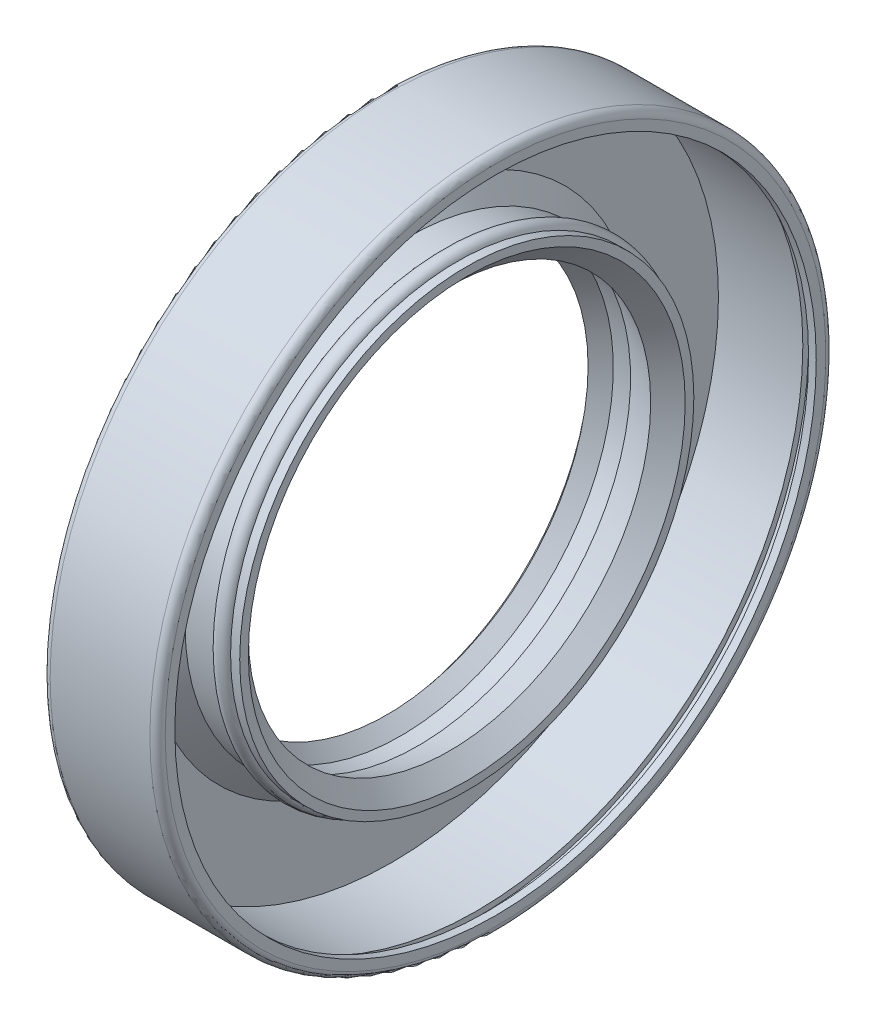
ISO-10303-21;
HEADER;
FILE_DESCRIPTION(('STEP AP214'),'2;1');
FILE_NAME('part.step','',(''),(''),'','','');
FILE_SCHEMA(('AUTOMOTIVE_DESIGN { 1 0 10303 214 1 1 1 1 }'));
ENDSEC;
DATA;
#1=APPLICATION_CONTEXT('core data for automotive mechanical design processes');
#2=APPLICATION_PROTOCOL_DEFINITION('international standard','automotive_design',2000,#1);
#3=PRODUCT_CONTEXT('',#1,'mechanical');
#4=PRODUCT('Part','Part','',(#3));
#5=PRODUCT_RELATED_PRODUCT_CATEGORY('part','',(#4));
#6=PRODUCT_DEFINITION_FORMATION('','',#4);
#7=PRODUCT_DEFINITION_CONTEXT('part definition',#1,'design');
#8=PRODUCT_DEFINITION('design','',#6,#7);
#9=PRODUCT_DEFINITION_SHAPE('','',#8);
#10=(LENGTH_UNIT() NAMED_UNIT(*) SI_UNIT(.MILLI.,.METRE.));
#11=(NAMED_UNIT(*) PLANE_ANGLE_UNIT() SI_UNIT($,.RADIAN.));
#12=(NAMED_UNIT(*) SI_UNIT($,.STERADIAN.) SOLID_ANGLE_UNIT());
#13=UNCERTAINTY_MEASURE_WITH_UNIT(LENGTH_MEASURE(1.E-05),#10,'distance_accuracy_value','');
#14=(GEOMETRIC_REPRESENTATION_CONTEXT(3) GLOBAL_UNCERTAINTY_ASSIGNED_CONTEXT((#13)) GLOBAL_UNIT_ASSIGNED_CONTEXT((#10,
#11,#12)) REPRESENTATION_CONTEXT('',''));
#15=CARTESIAN_POINT('',(0.,0.,0.));
#16=DIRECTION('',(0.,0.,1.));
#17=DIRECTION('',(1.,0.,0.));
#18=AXIS2_PLACEMENT_3D('',#15,#16,#17);
#19=CARTESIAN_POINT('',(0.,0.,-13.5725));
#20=DIRECTION('',(1.,0.,0.));
#21=DIRECTION('',(0.,0.,-1.));
#22=AXIS2_PLACEMENT_3D('',#19,#20,#21);
#23=PLANE('',#22);
#24=CARTESIAN_POINT('',(0.,0.,0.));
#25=DIRECTION('',(-1.,0.,0.));
#26=DIRECTION('',(0.,0.,1.));
#27=AXIS2_PLACEMENT_3D('',#24,#25,#26);
#28=CIRCLE('',#27,20.5233333333333);
#29=CARTESIAN_POINT('',(0.,0.,20.5233333333333));
#30=VERTEX_POINT('',#29);
#31=EDGE_CURVE('E70',#30,#30,#28,.T.);
#32=ORIENTED_EDGE('',*,*,#31,.T.);
#33=EDGE_LOOP('',(#32));
#34=FACE_BOUND('',#33,.T.);
#35=CARTESIAN_POINT('',(0.,0.,0.));
#36=DIRECTION('',(1.,0.,0.));
#37=DIRECTION('',(0.,0.,-1.));
#38=AXIS2_PLACEMENT_3D('',#35,#36,#37);
#39=CIRCLE('',#38,13.93);
#40=CARTESIAN_POINT('',(0.,0.,-13.93));
#41=VERTEX_POINT('',#40);
#42=EDGE_CURVE('E10',#41,#41,#39,.F.);
#43=ORIENTED_EDGE('',*,*,#42,.F.);
#44=EDGE_LOOP('',(#43));
#45=FACE_BOUND('',#44,.T.);
#46=ADVANCED_FACE('F32',(#34,#45),#23,.F.);
#47=CARTESIAN_POINT('',(0.,0.,0.));
#48=DIRECTION('',(-1.,0.,0.));
#49=DIRECTION('',(0.,0.,1.));
#50=AXIS2_PLACEMENT_3D('',#47,#48,#49);
#51=CYLINDRICAL_SURFACE('',#50,20.285);
#52=CARTESIAN_POINT('',(5.95833333333333,0.,0.));
#53=DIRECTION('',(-1.,0.,0.));
#54=DIRECTION('',(0.,0.,1.));
#55=AXIS2_PLACEMENT_3D('',#52,#53,#54);
#56=CIRCLE('',#55,20.285);
#57=CARTESIAN_POINT('',(5.95833333333333,0.,20.285));
#58=VERTEX_POINT('',#57);
#59=EDGE_CURVE('E40',#58,#58,#56,.T.);
#60=ORIENTED_EDGE('',*,*,#59,.F.);
#61=EDGE_LOOP('',(#60));
#62=FACE_BOUND('',#61,.T.);
#63=CARTESIAN_POINT('',(0.715,0.,0.));
#64=DIRECTION('',(-1.,0.,0.));
#65=DIRECTION('',(0.,0.,1.));
#66=AXIS2_PLACEMENT_3D('',#63,#64,#65);
#67=CIRCLE('',#66,20.285);
#68=CARTESIAN_POINT('',(0.715,0.,20.285));
#69=VERTEX_POINT('',#68);
#70=EDGE_CURVE('E112',#69,#69,#67,.T.);
#71=ORIENTED_EDGE('',*,*,#70,.T.);
#72=EDGE_LOOP('',(#71));
#73=FACE_BOUND('',#72,.T.);
#74=ADVANCED_FACE('F34',(#62,#73),#51,.F.);
#75=CARTESIAN_POINT('',(5.95833333333333,0.,-20.285));
#76=DIRECTION('',(-1.,0.,0.));
#77=DIRECTION('',(0.,0.,1.));
#78=AXIS2_PLACEMENT_3D('',#75,#76,#77);
#79=PLANE('',#78);
#80=CARTESIAN_POINT('',(5.95833333333333,0.,0.));
#81=DIRECTION('',(-1.,0.,0.));
#82=DIRECTION('',(0.,0.,1.));
#83=AXIS2_PLACEMENT_3D('',#80,#81,#82);
#84=CIRCLE('',#83,20.6425);
#85=CARTESIAN_POINT('',(5.95833333333333,0.,20.6425));
#86=VERTEX_POINT('',#85);
#87=EDGE_CURVE('E46',#86,#86,#84,.T.);
#88=ORIENTED_EDGE('',*,*,#87,.F.);
#89=EDGE_LOOP('',(#88));
#90=FACE_BOUND('',#89,.T.);
#91=ORIENTED_EDGE('',*,*,#59,.T.);
#92=EDGE_LOOP('',(#91));
#93=FACE_BOUND('',#92,.T.);
#94=ADVANCED_FACE('F210',(#90,#93),#79,.F.);
#95=CARTESIAN_POINT('',(0.,0.,0.));
#96=DIRECTION('',(-1.,0.,0.));
#97=DIRECTION('',(0.,0.,1.));
#98=AXIS2_PLACEMENT_3D('',#95,#96,#97);
#99=CYLINDRICAL_SURFACE('',#98,20.6425);
#100=CARTESIAN_POINT('',(6.67333333333333,0.,0.));
#101=DIRECTION('',(-1.,0.,0.));
#102=DIRECTION('',(0.,0.,1.));
#103=AXIS2_PLACEMENT_3D('',#100,#101,#102);
#104=CIRCLE('',#103,20.6425);
#105=CARTESIAN_POINT('',(6.67333333333333,0.,20.6425));
#106=VERTEX_POINT('',#105);
#107=EDGE_CURVE('E50',#106,#106,#104,.T.);
#108=ORIENTED_EDGE('',*,*,#107,.F.);
#109=EDGE_LOOP('',(#108));
#110=FACE_BOUND('',#109,.T.);
#111=ORIENTED_EDGE('',*,*,#87,.T.);
#112=EDGE_LOOP('',(#111));
#113=FACE_BOUND('',#112,.T.);
#114=ADVANCED_FACE('F243',(#110,#113),#99,.F.);
#115=CARTESIAN_POINT('',(6.67333333333333,0.,-20.6425));
#116=DIRECTION('',(1.,0.,0.));
#117=DIRECTION('',(0.,0.,-1.));
#118=AXIS2_PLACEMENT_3D('',#115,#116,#117);
#119=PLANE('',#118);
#120=CARTESIAN_POINT('',(6.67333333333333,0.,0.));
#121=DIRECTION('',(-1.,0.,0.));
#122=DIRECTION('',(0.,0.,1.));
#123=AXIS2_PLACEMENT_3D('',#120,#121,#122);
#124=CIRCLE('',#123,19.9275);
#125=CARTESIAN_POINT('',(6.67333333333333,0.,19.9275));
#126=VERTEX_POINT('',#125);
#127=EDGE_CURVE('E55',#126,#126,#124,.T.);
#128=ORIENTED_EDGE('',*,*,#127,.F.);
#129=EDGE_LOOP('',(#128));
#130=FACE_BOUND('',#129,.T.);
#131=ORIENTED_EDGE('',*,*,#107,.T.);
#132=EDGE_LOOP('',(#131));
#133=FACE_BOUND('',#132,.T.);
#134=ADVANCED_FACE('F237',(#130,#133),#119,.F.);
#135=CARTESIAN_POINT('',(0.,0.,0.));
#136=DIRECTION('',(-1.,0.,0.));
#137=DIRECTION('',(0.,0.,1.));
#138=AXIS2_PLACEMENT_3D('',#135,#136,#137);
#139=CYLINDRICAL_SURFACE('',#138,19.9275);
#140=CARTESIAN_POINT('',(7.15,0.,0.));
#141=DIRECTION('',(-1.,0.,0.));
#142=DIRECTION('',(0.,0.,1.));
#143=AXIS2_PLACEMENT_3D('',#140,#141,#142);
#144=CIRCLE('',#143,19.9275);
#145=CARTESIAN_POINT('',(7.15,0.,19.9275));
#146=VERTEX_POINT('',#145);
#147=EDGE_CURVE('E58',#146,#146,#144,.T.);
#148=ORIENTED_EDGE('',*,*,#147,.F.);
#149=EDGE_LOOP('',(#148));
#150=FACE_BOUND('',#149,.T.);
#151=ORIENTED_EDGE('',*,*,#127,.T.);
#152=EDGE_LOOP('',(#151));
#153=FACE_BOUND('',#152,.T.);
#154=ADVANCED_FACE('F231',(#150,#153),#139,.F.);
#155=CARTESIAN_POINT('',(7.15,0.,-19.9275));
#156=DIRECTION('',(-1.,0.,0.));
#157=DIRECTION('',(0.,0.,1.));
#158=AXIS2_PLACEMENT_3D('',#155,#156,#157);
#159=PLANE('',#158);
#160=CARTESIAN_POINT('',(7.15,0.,0.));
#161=DIRECTION('',(-1.,0.,0.));
#162=DIRECTION('',(0.,0.,1.));
#163=AXIS2_PLACEMENT_3D('',#160,#161,#162);
#164=CIRCLE('',#163,20.5233333333333);
#165=CARTESIAN_POINT('',(7.15,0.,20.5233333333333));
#166=VERTEX_POINT('',#165);
#167=EDGE_CURVE('E61',#166,#166,#164,.T.);
#168=ORIENTED_EDGE('',*,*,#167,.F.);
#169=EDGE_LOOP('',(#168));
#170=FACE_BOUND('',#169,.T.);
#171=ORIENTED_EDGE('',*,*,#147,.T.);
#172=EDGE_LOOP('',(#171));
#173=FACE_BOUND('',#172,.T.);
#174=ADVANCED_FACE('F225',(#170,#173),#159,.F.);
#175=CARTESIAN_POINT('',(6.67333333333333,0.,0.));
#176=DIRECTION('',(-1.,0.,0.));
#177=DIRECTION('',(0.,0.,1.));
#178=AXIS2_PLACEMENT_3D('',#175,#176,#177);
#179=TOROIDAL_SURFACE('',#178,20.5233333333333,0.476666666666667);
#180=CARTESIAN_POINT('',(6.67333333333333,0.,0.));
#181=DIRECTION('',(-1.,0.,0.));
#182=DIRECTION('',(0.,0.,1.));
#183=AXIS2_PLACEMENT_3D('',#180,#181,#182);
#184=CIRCLE('',#183,21.);
#185=CARTESIAN_POINT('',(6.67333333333333,0.,21.));
#186=VERTEX_POINT('',#185);
#187=EDGE_CURVE('E64',#186,#186,#184,.T.);
#188=ORIENTED_EDGE('',*,*,#187,.F.);
#189=EDGE_LOOP('',(#188));
#190=FACE_BOUND('',#189,.T.);
#191=ORIENTED_EDGE('',*,*,#167,.T.);
#192=EDGE_LOOP('',(#191));
#193=FACE_BOUND('',#192,.T.);
#194=ADVANCED_FACE('F219',(#190,#193),#179,.T.);
#195=CARTESIAN_POINT('',(0.,0.,0.));
#196=DIRECTION('',(-1.,0.,0.));
#197=DIRECTION('',(0.,0.,1.));
#198=AXIS2_PLACEMENT_3D('',#195,#196,#197);
#199=CYLINDRICAL_SURFACE('',#198,21.);
#200=CARTESIAN_POINT('',(0.476666666666667,0.,0.));
#201=DIRECTION('',(-1.,0.,0.));
#202=DIRECTION('',(0.,0.,1.));
#203=AXIS2_PLACEMENT_3D('',#200,#201,#202);
#204=CIRCLE('',#203,21.);
#205=CARTESIAN_POINT('',(0.476666666666667,0.,21.));
#206=VERTEX_POINT('',#205);
#207=EDGE_CURVE('E67',#206,#206,#204,.T.);
#208=ORIENTED_EDGE('',*,*,#207,.F.);
#209=EDGE_LOOP('',(#208));
#210=FACE_BOUND('',#209,.T.);
#211=ORIENTED_EDGE('',*,*,#187,.T.);
#212=EDGE_LOOP('',(#211));
#213=FACE_BOUND('',#212,.T.);
#214=ADVANCED_FACE('F202',(#210,#213),#199,.T.);
#215=CARTESIAN_POINT('',(0.476666666666667,0.,0.));
#216=DIRECTION('',(-1.,0.,0.));
#217=DIRECTION('',(0.,0.,1.));
#218=AXIS2_PLACEMENT_3D('',#215,#216,#217);
#219=TOROIDAL_SURFACE('',#218,20.5233333333333,0.476666666666667);
#220=ORIENTED_EDGE('',*,*,#31,.F.);
#221=EDGE_LOOP('',(#220));
#222=FACE_BOUND('',#221,.T.);
#223=ORIENTED_EDGE('',*,*,#207,.T.);
#224=EDGE_LOOP('',(#223));
#225=FACE_BOUND('',#224,.T.);
#226=ADVANCED_FACE('F197',(#222,#225),#219,.T.);
#227=ORIENTED_EDGE('',*,*,#42,.T.);
#228=EDGE_LOOP('',(#227));
#229=FACE_BOUND('',#228,.T.);
#230=CARTESIAN_POINT('',(0.,0.,0.));
#231=DIRECTION('',(-1.,0.,0.));
#232=DIRECTION('',(0.,0.,1.));
#233=AXIS2_PLACEMENT_3D('',#230,#231,#232);
#234=CIRCLE('',#233,13.5725);
#235=CARTESIAN_POINT('',(0.,0.,13.5725));
#236=VERTEX_POINT('',#235);
#237=EDGE_CURVE('E73',#236,#236,#234,.T.);
#238=ORIENTED_EDGE('',*,*,#237,.F.);
#239=EDGE_LOOP('',(#238));
#240=FACE_BOUND('',#239,.T.);
#241=ADVANCED_FACE('F192',(#229,#240),#23,.F.);
#242=CARTESIAN_POINT('',(0.,0.,0.));
#243=DIRECTION('',(-1.,0.,0.));
#244=DIRECTION('',(0.,0.,1.));
#245=AXIS2_PLACEMENT_3D('',#242,#243,#244);
#246=CONICAL_SURFACE('',#245,13.5725,0.872664625997168);
#247=CARTESIAN_POINT('',(0.292816141016435,0.,0.));
#248=DIRECTION('',(-1.,0.,0.));
#249=DIRECTION('',(0.,0.,1.));
#250=AXIS2_PLACEMENT_3D('',#247,#248,#249);
#251=CIRCLE('',#250,13.2235353119741);
#252=CARTESIAN_POINT('',(0.292816141016435,0.,13.2235353119741));
#253=VERTEX_POINT('',#252);
#254=EDGE_CURVE('E76',#253,#253,#251,.T.);
#255=ORIENTED_EDGE('',*,*,#254,.F.);
#256=EDGE_LOOP('',(#255));
#257=FACE_BOUND('',#256,.T.);
#258=ORIENTED_EDGE('',*,*,#237,.T.);
#259=EDGE_LOOP('',(#258));
#260=FACE_BOUND('',#259,.T.);
#261=ADVANCED_FACE('F186',(#257,#260),#246,.F.);
#262=CARTESIAN_POINT('',(0.292816141016435,0.,0.));
#263=DIRECTION('',(1.,0.,0.));
#264=DIRECTION('',(0.,0.,-1.));
#265=AXIS2_PLACEMENT_3D('',#262,#263,#264);
#266=CONICAL_SURFACE('',#265,13.2235353119741,0.69813170079773);
#267=CARTESIAN_POINT('',(0.,0.,0.));
#268=DIRECTION('',(-1.,0.,0.));
#269=DIRECTION('',(0.,0.,1.));
#270=AXIS2_PLACEMENT_3D('',#267,#268,#269);
#271=CIRCLE('',#270,12.9778333960444);
#272=CARTESIAN_POINT('',(0.,0.,12.9778333960444));
#273=VERTEX_POINT('',#272);
#274=EDGE_CURVE('E79',#273,#273,#271,.T.);
#275=ORIENTED_EDGE('',*,*,#274,.F.);
#276=EDGE_LOOP('',(#275));
#277=FACE_BOUND('',#276,.T.);
#278=ORIENTED_EDGE('',*,*,#254,.T.);
#279=EDGE_LOOP('',(#278));
#280=FACE_BOUND('',#279,.T.);
#281=ADVANCED_FACE('F180',(#277,#280),#266,.T.);
#282=CARTESIAN_POINT('',(0.,0.,0.));
#283=DIRECTION('',(-1.,0.,0.));
#284=DIRECTION('',(0.,0.,1.));
#285=AXIS2_PLACEMENT_3D('',#282,#283,#284);
#286=CONICAL_SURFACE('',#285,12.9778333960444,0.872664625997167);
#287=CARTESIAN_POINT('',(0.400949826385081,0.,0.));
#288=DIRECTION('',(-1.,0.,0.));
#289=DIRECTION('',(0.,0.,1.));
#290=AXIS2_PLACEMENT_3D('',#287,#288,#289);
#291=CIRCLE('',#290,12.5);
#292=CARTESIAN_POINT('',(0.400949826385081,0.,12.5));
#293=VERTEX_POINT('',#292);
#294=EDGE_CURVE('E82',#293,#293,#291,.T.);
#295=ORIENTED_EDGE('',*,*,#294,.F.);
#296=EDGE_LOOP('',(#295));
#297=FACE_BOUND('',#296,.T.);
#298=ORIENTED_EDGE('',*,*,#274,.T.);
#299=EDGE_LOOP('',(#298));
#300=FACE_BOUND('',#299,.T.);
#301=ADVANCED_FACE('F174',(#297,#300),#286,.F.);
#302=CARTESIAN_POINT('',(0.400949826385081,0.,0.));
#303=DIRECTION('',(1.,0.,0.));
#304=DIRECTION('',(0.,0.,-1.));
#305=AXIS2_PLACEMENT_3D('',#302,#303,#304);
#306=CONICAL_SURFACE('',#305,12.5,0.69813170079773);
#307=CARTESIAN_POINT('',(1.25305364508995,0.,0.));
#308=DIRECTION('',(-1.,0.,0.));
#309=DIRECTION('',(0.,0.,1.));
#310=AXIS2_PLACEMENT_3D('',#307,#308,#309);
#311=CIRCLE('',#310,13.215);
#312=CARTESIAN_POINT('',(1.25305364508995,0.,13.215));
#313=VERTEX_POINT('',#312);
#314=EDGE_CURVE('E85',#313,#313,#311,.T.);
#315=ORIENTED_EDGE('',*,*,#314,.F.);
#316=EDGE_LOOP('',(#315));
#317=FACE_BOUND('',#316,.T.);
#318=ORIENTED_EDGE('',*,*,#294,.T.);
#319=EDGE_LOOP('',(#318));
#320=FACE_BOUND('',#319,.T.);
#321=ADVANCED_FACE('F168',(#317,#320),#306,.F.);
#322=CARTESIAN_POINT('',(0.,0.,0.));
#323=DIRECTION('',(-1.,0.,0.));
#324=DIRECTION('',(0.,0.,1.));
#325=AXIS2_PLACEMENT_3D('',#322,#323,#324);
#326=CYLINDRICAL_SURFACE('',#325,13.215);
#327=CARTESIAN_POINT('',(2.32555364508995,0.,0.));
#328=DIRECTION('',(-1.,0.,0.));
#329=DIRECTION('',(0.,0.,1.));
#330=AXIS2_PLACEMENT_3D('',#327,#328,#329);
#331=CIRCLE('',#330,13.215);
#332=CARTESIAN_POINT('',(2.32555364508995,0.,13.215));
#333=VERTEX_POINT('',#332);
#334=EDGE_CURVE('E88',#333,#333,#331,.T.);
#335=ORIENTED_EDGE('',*,*,#334,.F.);
#336=EDGE_LOOP('',(#335));
#337=FACE_BOUND('',#336,.T.);
#338=ORIENTED_EDGE('',*,*,#314,.T.);
#339=EDGE_LOOP('',(#338));
#340=FACE_BOUND('',#339,.T.);
#341=ADVANCED_FACE('F162',(#337,#340),#326,.F.);
#342=CARTESIAN_POINT('',(2.32555364508995,0.,0.));
#343=DIRECTION('',(-1.,0.,0.));
#344=DIRECTION('',(0.,0.,1.));
#345=AXIS2_PLACEMENT_3D('',#342,#343,#344);
#346=CONICAL_SURFACE('',#345,13.215,0.349065850398866);
#347=CARTESIAN_POINT('',(4.29,0.,0.));
#348=DIRECTION('',(-1.,0.,0.));
#349=DIRECTION('',(0.,0.,1.));
#350=AXIS2_PLACEMENT_3D('',#347,#348,#349);
#351=CIRCLE('',#350,12.5);
#352=CARTESIAN_POINT('',(4.29,0.,12.5));
#353=VERTEX_POINT('',#352);
#354=EDGE_CURVE('E91',#353,#353,#351,.T.);
#355=ORIENTED_EDGE('',*,*,#354,.F.);
#356=EDGE_LOOP('',(#355));
#357=FACE_BOUND('',#356,.T.);
#358=ORIENTED_EDGE('',*,*,#334,.T.);
#359=EDGE_LOOP('',(#358));
#360=FACE_BOUND('',#359,.T.);
#361=ADVANCED_FACE('F156',(#357,#360),#346,.F.);
#362=CARTESIAN_POINT('',(4.29,0.,0.));
#363=DIRECTION('',(1.,0.,0.));
#364=DIRECTION('',(0.,0.,-1.));
#365=AXIS2_PLACEMENT_3D('',#362,#363,#364);
#366=CONICAL_SURFACE('',#365,12.5,0.785398163397449);
#367=CARTESIAN_POINT('',(5.3625,0.,0.));
#368=DIRECTION('',(-1.,0.,0.));
#369=DIRECTION('',(0.,0.,1.));
#370=AXIS2_PLACEMENT_3D('',#367,#368,#369);
#371=CIRCLE('',#370,13.5725);
#372=CARTESIAN_POINT('',(5.3625,0.,13.5725));
#373=VERTEX_POINT('',#372);
#374=EDGE_CURVE('E94',#373,#373,#371,.T.);
#375=ORIENTED_EDGE('',*,*,#374,.F.);
#376=EDGE_LOOP('',(#375));
#377=FACE_BOUND('',#376,.T.);
#378=ORIENTED_EDGE('',*,*,#354,.T.);
#379=EDGE_LOOP('',(#378));
#380=FACE_BOUND('',#379,.T.);
#381=ADVANCED_FACE('F150',(#377,#380),#366,.F.);
#382=CARTESIAN_POINT('',(5.3625,0.,-13.5725));
#383=DIRECTION('',(-1.,0.,0.));
#384=DIRECTION('',(0.,0.,1.));
#385=AXIS2_PLACEMENT_3D('',#382,#383,#384);
#386=PLANE('',#385);
#387=CARTESIAN_POINT('',(5.3625,0.,0.));
#388=DIRECTION('',(-1.,0.,0.));
#389=DIRECTION('',(0.,0.,1.));
#390=AXIS2_PLACEMENT_3D('',#387,#388,#389);
#391=CIRCLE('',#390,14.10875);
#392=CARTESIAN_POINT('',(5.3625,0.,14.10875));
#393=VERTEX_POINT('',#392);
#394=EDGE_CURVE('E97',#393,#393,#391,.T.);
#395=ORIENTED_EDGE('',*,*,#394,.F.);
#396=EDGE_LOOP('',(#395));
#397=FACE_BOUND('',#396,.T.);
#398=ORIENTED_EDGE('',*,*,#374,.T.);
#399=EDGE_LOOP('',(#398));
#400=FACE_BOUND('',#399,.T.);
#401=ADVANCED_FACE('F144',(#397,#400),#386,.F.);
#402=CARTESIAN_POINT('',(0.,0.,0.));
#403=DIRECTION('',(-1.,0.,0.));
#404=DIRECTION('',(0.,0.,1.));
#405=AXIS2_PLACEMENT_3D('',#402,#403,#404);
#406=CYLINDRICAL_SURFACE('',#405,14.10875);
#407=CARTESIAN_POINT('',(4.79558134854838,0.,0.));
#408=DIRECTION('',(-1.,0.,0.));
#409=DIRECTION('',(0.,0.,1.));
#410=AXIS2_PLACEMENT_3D('',#407,#408,#409);
#411=CIRCLE('',#410,14.10875);
#412=CARTESIAN_POINT('',(4.79558134854838,0.,14.10875));
#413=VERTEX_POINT('',#412);
#414=EDGE_CURVE('E100',#413,#413,#411,.T.);
#415=ORIENTED_EDGE('',*,*,#414,.F.);
#416=EDGE_LOOP('',(#415));
#417=FACE_BOUND('',#416,.T.);
#418=ORIENTED_EDGE('',*,*,#394,.T.);
#419=EDGE_LOOP('',(#418));
#420=FACE_BOUND('',#419,.T.);
#421=ADVANCED_FACE('F138',(#417,#420),#406,.T.);
#422=CARTESIAN_POINT('',(4.29,0.,0.));
#423=DIRECTION('',(-1.,0.,0.));
#424=DIRECTION('',(0.,0.,1.));
#425=AXIS2_PLACEMENT_3D('',#422,#423,#424);
#426=TOROIDAL_SURFACE('',#425,13.93,0.53625);
#427=CARTESIAN_POINT('',(3.75375,0.,0.));
#428=DIRECTION('',(-1.,0.,0.));
#429=DIRECTION('',(0.,0.,1.));
#430=AXIS2_PLACEMENT_3D('',#427,#428,#429);
#431=CIRCLE('',#430,13.93);
#432=CARTESIAN_POINT('',(3.75375,0.,13.93));
#433=VERTEX_POINT('',#432);
#434=EDGE_CURVE('E103',#433,#433,#431,.T.);
#435=ORIENTED_EDGE('',*,*,#434,.F.);
#436=EDGE_LOOP('',(#435));
#437=FACE_BOUND('',#436,.T.);
#438=ORIENTED_EDGE('',*,*,#414,.T.);
#439=EDGE_LOOP('',(#438));
#440=FACE_BOUND('',#439,.T.);
#441=ADVANCED_FACE('F132',(#437,#440),#426,.T.);
#442=CARTESIAN_POINT('',(0.,0.,0.));
#443=DIRECTION('',(-1.,0.,0.));
#444=DIRECTION('',(0.,0.,1.));
#445=AXIS2_PLACEMENT_3D('',#442,#443,#444);
#446=CYLINDRICAL_SURFACE('',#445,13.93);
#447=CARTESIAN_POINT('',(1.7875,0.,0.));
#448=DIRECTION('',(-1.,0.,0.));
#449=DIRECTION('',(0.,0.,1.));
#450=AXIS2_PLACEMENT_3D('',#447,#448,#449);
#451=CIRCLE('',#450,13.93);
#452=CARTESIAN_POINT('',(1.7875,0.,13.93));
#453=VERTEX_POINT('',#452);
#454=EDGE_CURVE('E106',#453,#453,#451,.T.);
#455=ORIENTED_EDGE('',*,*,#454,.F.);
#456=EDGE_LOOP('',(#455));
#457=FACE_BOUND('',#456,.T.);
#458=ORIENTED_EDGE('',*,*,#434,.T.);
#459=EDGE_LOOP('',(#458));
#460=FACE_BOUND('',#459,.T.);
#461=ADVANCED_FACE('F126',(#457,#460),#446,.T.);
#462=CARTESIAN_POINT('',(1.7875,0.,0.));
#463=DIRECTION('',(-1.,0.,0.));
#464=DIRECTION('',(0.,0.,1.));
#465=AXIS2_PLACEMENT_3D('',#462,#463,#464);
#466=CONICAL_SURFACE('',#465,13.93,0.872664625997166);
#467=CARTESIAN_POINT('',(0.715000000000001,0.,0.));
#468=DIRECTION('',(-1.,0.,0.));
#469=DIRECTION('',(0.,0.,1.));
#470=AXIS2_PLACEMENT_3D('',#467,#468,#469);
#471=CIRCLE('',#470,15.2081557280573);
#472=CARTESIAN_POINT('',(0.715000000000001,0.,15.2081557280573));
#473=VERTEX_POINT('',#472);
#474=EDGE_CURVE('E109',#473,#473,#471,.T.);
#475=ORIENTED_EDGE('',*,*,#474,.F.);
#476=EDGE_LOOP('',(#475));
#477=FACE_BOUND('',#476,.T.);
#478=ORIENTED_EDGE('',*,*,#454,.T.);
#479=EDGE_LOOP('',(#478));
#480=FACE_BOUND('',#479,.T.);
#481=ADVANCED_FACE('F120',(#477,#480),#466,.T.);
#482=CARTESIAN_POINT('',(0.715,0.,-20.285));
#483=DIRECTION('',(-1.,0.,0.));
#484=DIRECTION('',(0.,0.,1.));
#485=AXIS2_PLACEMENT_3D('',#482,#483,#484);
#486=PLANE('',#485);
#487=ORIENTED_EDGE('',*,*,#70,.F.);
#488=EDGE_LOOP('',(#487));
#489=FACE_BOUND('',#488,.T.);
#490=ORIENTED_EDGE('',*,*,#474,.T.);
#491=EDGE_LOOP('',(#490));
#492=FACE_BOUND('',#491,.T.);
#493=ADVANCED_FACE('F117',(#489,#492),#486,.F.);
#494=CLOSED_SHELL('',(#46,#74,#94,#114,#134,#154,#174,#194,#214,#226,#241,#261,#281,#301,#321,
#341,#361,#381,#401,#421,#441,#461,#481,#493));
#495=MANIFOLD_SOLID_BREP('B2',#494);
#496=ADVANCED_BREP_SHAPE_REPRESENTATION('',(#18,#495),#14);
#497=SHAPE_DEFINITION_REPRESENTATION(#9,#496);
ENDSEC;
END-ISO-10303-21;
